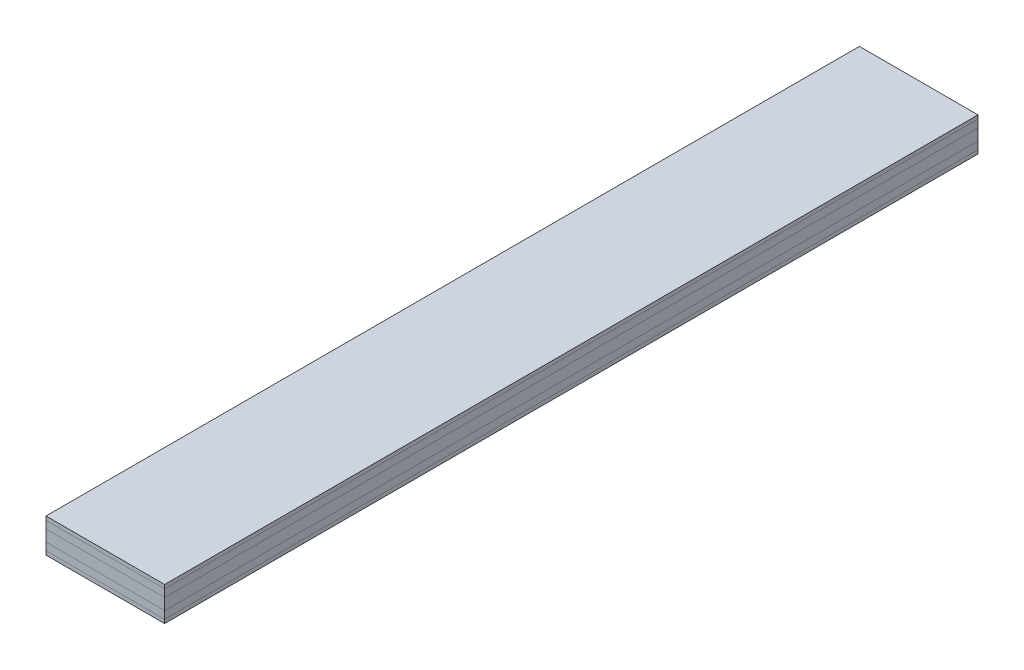
ISO-10303-21;
HEADER;
FILE_DESCRIPTION(('STEP AP214'),'2;1');
FILE_NAME('part.step','',(''),(''),'','','');
FILE_SCHEMA(('AUTOMOTIVE_DESIGN { 1 0 10303 214 1 1 1 1 }'));
ENDSEC;
DATA;
#1=APPLICATION_CONTEXT('core data for automotive mechanical design processes');
#2=APPLICATION_PROTOCOL_DEFINITION('international standard','automotive_design',2000,#1);
#3=PRODUCT_CONTEXT('',#1,'mechanical');
#4=PRODUCT('Part','Part','',(#3));
#5=PRODUCT_RELATED_PRODUCT_CATEGORY('part','',(#4));
#6=PRODUCT_DEFINITION_FORMATION('','',#4);
#7=PRODUCT_DEFINITION_CONTEXT('part definition',#1,'design');
#8=PRODUCT_DEFINITION('design','',#6,#7);
#9=PRODUCT_DEFINITION_SHAPE('','',#8);
#10=(LENGTH_UNIT() NAMED_UNIT(*) SI_UNIT(.MILLI.,.METRE.));
#11=(NAMED_UNIT(*) PLANE_ANGLE_UNIT() SI_UNIT($,.RADIAN.));
#12=(NAMED_UNIT(*) SI_UNIT($,.STERADIAN.) SOLID_ANGLE_UNIT());
#13=UNCERTAINTY_MEASURE_WITH_UNIT(LENGTH_MEASURE(1.E-05),#10,'distance_accuracy_value','');
#14=(GEOMETRIC_REPRESENTATION_CONTEXT(3) GLOBAL_UNCERTAINTY_ASSIGNED_CONTEXT((#13)) GLOBAL_UNIT_ASSIGNED_CONTEXT((#10,
#11,#12)) REPRESENTATION_CONTEXT('',''));
#15=CARTESIAN_POINT('',(0.,0.,0.));
#16=DIRECTION('',(0.,0.,1.));
#17=DIRECTION('',(1.,0.,0.));
#18=AXIS2_PLACEMENT_3D('',#15,#16,#17);
#19=CARTESIAN_POINT('',(-335.28,-2.82222222222222,-609.61));
#20=DIRECTION('',(0.,-1.,0.));
#21=DIRECTION('',(1.,0.,0.));
#22=AXIS2_PLACEMENT_3D('',#19,#20,#21);
#23=PLANE('',#22);
#24=DIRECTION('',(0.,0.,1.));
#25=VECTOR('',#24,1.);
#26=CARTESIAN_POINT('',(215.9,-2.82222222222212,-609.61));
#27=LINE('',#26,#25);
#28=CARTESIAN_POINT('',(215.9,-2.82222222222212,0.));
#29=VERTEX_POINT('',#28);
#30=CARTESIAN_POINT('',(215.9,-2.82222222222212,609.6));
#31=VERTEX_POINT('',#30);
#32=EDGE_CURVE('E64',#29,#31,#27,.T.);
#33=ORIENTED_EDGE('',*,*,#32,.F.);
#34=DIRECTION('',(-1.,0.,0.));
#35=VECTOR('',#34,1.);
#36=CARTESIAN_POINT('',(-335.280000000001,-2.82222222222222,-4.44089209850063E-13));
#37=LINE('',#36,#35);
#38=CARTESIAN_POINT('',(304.8,-2.82222222222217,3.25136742925939E-13));
#39=VERTEX_POINT('',#38);
#40=EDGE_CURVE('E97',#39,#29,#37,.T.);
#41=ORIENTED_EDGE('',*,*,#40,.F.);
#42=DIRECTION('',(0.,0.,-1.));
#43=VECTOR('',#42,1.);
#44=CARTESIAN_POINT('',(304.8,-2.8222222222221,-609.6));
#45=LINE('',#44,#43);
#46=CARTESIAN_POINT('',(304.8,-2.82222222222217,609.6));
#47=VERTEX_POINT('',#46);
#48=EDGE_CURVE('E109',#47,#39,#45,.T.);
#49=ORIENTED_EDGE('',*,*,#48,.F.);
#50=DIRECTION('',(1.,0.,0.));
#51=VECTOR('',#50,1.);
#52=CARTESIAN_POINT('',(-304.8,-2.82222222222222,609.6));
#53=LINE('',#52,#51);
#54=EDGE_CURVE('E113',#31,#47,#53,.T.);
#55=ORIENTED_EDGE('',*,*,#54,.F.);
#56=EDGE_LOOP('',(#33,#41,#49,#55));
#57=FACE_BOUND('',#56,.T.);
#58=ADVANCED_FACE('F49',(#57),#23,.T.);
#59=CARTESIAN_POINT('',(0.,0.,0.));
#60=DIRECTION('',(0.,1.,0.));
#61=DIRECTION('',(0.,0.,1.));
#62=AXIS2_PLACEMENT_3D('',#59,#60,#61);
#63=PLANE('',#62);
#64=DIRECTION('',(0.,0.,-1.));
#65=VECTOR('',#64,1.);
#66=CARTESIAN_POINT('',(215.9,0.,0.));
#67=LINE('',#66,#65);
#68=CARTESIAN_POINT('',(215.9,0.,609.6));
#69=VERTEX_POINT('',#68);
#70=CARTESIAN_POINT('',(215.9,0.,0.));
#71=VERTEX_POINT('',#70);
#72=EDGE_CURVE('E99',#69,#71,#67,.T.);
#73=ORIENTED_EDGE('',*,*,#72,.F.);
#74=DIRECTION('',(1.,0.,0.));
#75=VECTOR('',#74,1.);
#76=CARTESIAN_POINT('',(-304.8,0.,609.6));
#77=LINE('',#76,#75);
#78=CARTESIAN_POINT('',(304.8,0.,609.6));
#79=VERTEX_POINT('',#78);
#80=EDGE_CURVE('E72',#69,#79,#77,.T.);
#81=ORIENTED_EDGE('',*,*,#80,.T.);
#82=DIRECTION('',(0.,0.,-1.));
#83=VECTOR('',#82,1.);
#84=CARTESIAN_POINT('',(304.8,0.,-609.6));
#85=LINE('',#84,#83);
#86=CARTESIAN_POINT('',(304.8,0.,3.25136742925939E-13));
#87=VERTEX_POINT('',#86);
#88=EDGE_CURVE('E104',#79,#87,#85,.T.);
#89=ORIENTED_EDGE('',*,*,#88,.T.);
#90=DIRECTION('',(1.,0.,0.));
#91=VECTOR('',#90,1.);
#92=CARTESIAN_POINT('',(0.,0.,0.));
#93=LINE('',#92,#91);
#94=EDGE_CURVE('E94',#71,#87,#93,.T.);
#95=ORIENTED_EDGE('',*,*,#94,.F.);
#96=EDGE_LOOP('',(#73,#81,#89,#95));
#97=FACE_BOUND('',#96,.T.);
#98=ADVANCED_FACE('F102',(#97),#63,.T.);
#99=CARTESIAN_POINT('',(304.8,-25.4,-609.6));
#100=DIRECTION('',(1.,0.,0.));
#101=DIRECTION('',(0.,0.,-1.));
#102=AXIS2_PLACEMENT_3D('',#99,#100,#101);
#103=PLANE('',#102);
#104=DIRECTION('',(0.,-1.,0.));
#105=VECTOR('',#104,1.);
#106=CARTESIAN_POINT('',(304.8,-25.4,2.22044604925031E-13));
#107=LINE('',#106,#105);
#108=EDGE_CURVE('E12',#87,#39,#107,.T.);
#109=ORIENTED_EDGE('',*,*,#108,.F.);
#110=ORIENTED_EDGE('',*,*,#88,.F.);
#111=DIRECTION('',(0.,1.,0.));
#112=VECTOR('',#111,1.);
#113=CARTESIAN_POINT('',(304.8,-25.4,609.6));
#114=LINE('',#113,#112);
#115=EDGE_CURVE('E111',#47,#79,#114,.T.);
#116=ORIENTED_EDGE('',*,*,#115,.F.);
#117=ORIENTED_EDGE('',*,*,#48,.T.);
#118=EDGE_LOOP('',(#109,#110,#116,#117));
#119=FACE_BOUND('',#118,.T.);
#120=ADVANCED_FACE('F122',(#119),#103,.T.);
#121=CARTESIAN_POINT('',(-304.8,-25.4,609.6));
#122=DIRECTION('',(0.,0.,1.));
#123=DIRECTION('',(1.,0.,0.));
#124=AXIS2_PLACEMENT_3D('',#121,#122,#123);
#125=PLANE('',#124);
#126=DIRECTION('',(0.,1.,0.));
#127=VECTOR('',#126,1.);
#128=CARTESIAN_POINT('',(215.9,-25.4,609.6));
#129=LINE('',#128,#127);
#130=EDGE_CURVE('E57',#31,#69,#129,.T.);
#131=ORIENTED_EDGE('',*,*,#130,.F.);
#132=ORIENTED_EDGE('',*,*,#54,.T.);
#133=ORIENTED_EDGE('',*,*,#115,.T.);
#134=ORIENTED_EDGE('',*,*,#80,.F.);
#135=EDGE_LOOP('',(#131,#132,#133,#134));
#136=FACE_BOUND('',#135,.T.);
#137=ADVANCED_FACE('F51',(#136),#125,.T.);
#138=CARTESIAN_POINT('',(215.9,-25.4,0.));
#139=DIRECTION('',(1.,0.,0.));
#140=DIRECTION('',(0.,0.,-1.));
#141=AXIS2_PLACEMENT_3D('',#138,#139,#140);
#142=PLANE('',#141);
#143=ORIENTED_EDGE('',*,*,#32,.T.);
#144=ORIENTED_EDGE('',*,*,#130,.T.);
#145=ORIENTED_EDGE('',*,*,#72,.T.);
#146=DIRECTION('',(0.,1.,0.));
#147=VECTOR('',#146,1.);
#148=CARTESIAN_POINT('',(215.9,-25.4,0.));
#149=LINE('',#148,#147);
#150=EDGE_CURVE('E90',#29,#71,#149,.T.);
#151=ORIENTED_EDGE('',*,*,#150,.F.);
#152=EDGE_LOOP('',(#143,#144,#145,#151));
#153=FACE_BOUND('',#152,.T.);
#154=ADVANCED_FACE('F100',(#153),#142,.F.);
#155=CARTESIAN_POINT('',(0.,-25.4,0.));
#156=DIRECTION('',(0.,0.,1.));
#157=DIRECTION('',(1.,0.,0.));
#158=AXIS2_PLACEMENT_3D('',#155,#156,#157);
#159=PLANE('',#158);
#160=ORIENTED_EDGE('',*,*,#40,.T.);
#161=ORIENTED_EDGE('',*,*,#150,.T.);
#162=ORIENTED_EDGE('',*,*,#94,.T.);
#163=ORIENTED_EDGE('',*,*,#108,.T.);
#164=EDGE_LOOP('',(#160,#161,#162,#163));
#165=FACE_BOUND('',#164,.T.);
#166=ADVANCED_FACE('F92',(#165),#159,.F.);
#167=CLOSED_SHELL('',(#58,#98,#120,#137,#154,#166));
#168=MANIFOLD_SOLID_BREP('B2',#167);
#169=CARTESIAN_POINT('',(-335.28,-22.5777777777778,-609.61));
#170=DIRECTION('',(0.,-1.,0.));
#171=DIRECTION('',(1.,0.,0.));
#172=AXIS2_PLACEMENT_3D('',#169,#170,#171);
#173=PLANE('',#172);
#174=DIRECTION('',(-1.,0.,0.));
#175=VECTOR('',#174,1.);
#176=CARTESIAN_POINT('',(-335.280000000001,-22.5777777777778,-4.44089209850063E-13));
#177=LINE('',#176,#175);
#178=CARTESIAN_POINT('',(304.8,-22.5777777777777,3.25136742925939E-13));
#179=VERTEX_POINT('',#178);
#180=CARTESIAN_POINT('',(215.9,-22.5777777777777,0.));
#181=VERTEX_POINT('',#180);
#182=EDGE_CURVE('E244',#179,#181,#177,.T.);
#183=ORIENTED_EDGE('',*,*,#182,.T.);
#184=DIRECTION('',(0.,0.,1.));
#185=VECTOR('',#184,1.);
#186=CARTESIAN_POINT('',(215.9,-22.5777777777777,-609.61));
#187=LINE('',#186,#185);
#188=CARTESIAN_POINT('',(215.9,-22.5777777777777,609.6));
#189=VERTEX_POINT('',#188);
#190=EDGE_CURVE('E230',#181,#189,#187,.T.);
#191=ORIENTED_EDGE('',*,*,#190,.T.);
#192=DIRECTION('',(1.,0.,0.));
#193=VECTOR('',#192,1.);
#194=CARTESIAN_POINT('',(-304.8,-22.5777777777778,609.6));
#195=LINE('',#194,#193);
#196=CARTESIAN_POINT('',(304.8,-22.5777777777777,609.6));
#197=VERTEX_POINT('',#196);
#198=EDGE_CURVE('E248',#189,#197,#195,.T.);
#199=ORIENTED_EDGE('',*,*,#198,.T.);
#200=DIRECTION('',(0.,0.,-1.));
#201=VECTOR('',#200,1.);
#202=CARTESIAN_POINT('',(304.8,-22.5777777777777,-609.6));
#203=LINE('',#202,#201);
#204=EDGE_CURVE('E186',#197,#179,#203,.T.);
#205=ORIENTED_EDGE('',*,*,#204,.T.);
#206=EDGE_LOOP('',(#183,#191,#199,#205));
#207=FACE_BOUND('',#206,.T.);
#208=ADVANCED_FACE('F182',(#207),#173,.F.);
#209=CARTESIAN_POINT('',(304.8,-25.4,-609.6));
#210=DIRECTION('',(1.,0.,0.));
#211=DIRECTION('',(0.,0.,-1.));
#212=AXIS2_PLACEMENT_3D('',#209,#210,#211);
#213=PLANE('',#212);
#214=DIRECTION('',(0.,1.,0.));
#215=VECTOR('',#214,1.);
#216=CARTESIAN_POINT('',(304.8,-25.4,3.25136742925939E-13));
#217=LINE('',#216,#215);
#218=CARTESIAN_POINT('',(304.8,-25.4,3.33066907387547E-13));
#219=VERTEX_POINT('',#218);
#220=EDGE_CURVE('E199',#219,#179,#217,.T.);
#221=ORIENTED_EDGE('',*,*,#220,.T.);
#222=ORIENTED_EDGE('',*,*,#204,.F.);
#223=DIRECTION('',(0.,1.,0.));
#224=VECTOR('',#223,1.);
#225=CARTESIAN_POINT('',(304.8,-25.4,609.6));
#226=LINE('',#225,#224);
#227=CARTESIAN_POINT('',(304.8,-25.4,609.6));
#228=VERTEX_POINT('',#227);
#229=EDGE_CURVE('E249',#228,#197,#226,.T.);
#230=ORIENTED_EDGE('',*,*,#229,.F.);
#231=DIRECTION('',(0.,0.,-1.));
#232=VECTOR('',#231,1.);
#233=CARTESIAN_POINT('',(304.8,-25.4,-609.6));
#234=LINE('',#233,#232);
#235=EDGE_CURVE('E191',#228,#219,#234,.T.);
#236=ORIENTED_EDGE('',*,*,#235,.T.);
#237=EDGE_LOOP('',(#221,#222,#230,#236));
#238=FACE_BOUND('',#237,.T.);
#239=ADVANCED_FACE('F256',(#238),#213,.T.);
#240=CARTESIAN_POINT('',(-304.8,-25.4,609.6));
#241=DIRECTION('',(0.,0.,1.));
#242=DIRECTION('',(1.,0.,0.));
#243=AXIS2_PLACEMENT_3D('',#240,#241,#242);
#244=PLANE('',#243);
#245=DIRECTION('',(0.,1.,0.));
#246=VECTOR('',#245,1.);
#247=CARTESIAN_POINT('',(215.9,-25.4,609.6));
#248=LINE('',#247,#246);
#249=CARTESIAN_POINT('',(215.9,-25.4,609.6));
#250=VERTEX_POINT('',#249);
#251=EDGE_CURVE('E242',#250,#189,#248,.T.);
#252=ORIENTED_EDGE('',*,*,#251,.F.);
#253=DIRECTION('',(1.,0.,0.));
#254=VECTOR('',#253,1.);
#255=CARTESIAN_POINT('',(-304.8,-25.4,609.6));
#256=LINE('',#255,#254);
#257=EDGE_CURVE('E47',#250,#228,#256,.T.);
#258=ORIENTED_EDGE('',*,*,#257,.T.);
#259=ORIENTED_EDGE('',*,*,#229,.T.);
#260=ORIENTED_EDGE('',*,*,#198,.F.);
#261=EDGE_LOOP('',(#252,#258,#259,#260));
#262=FACE_BOUND('',#261,.T.);
#263=ADVANCED_FACE('F184',(#262),#244,.T.);
#264=CARTESIAN_POINT('',(0.,-25.4,0.));
#265=DIRECTION('',(0.,1.,0.));
#266=DIRECTION('',(0.,0.,1.));
#267=AXIS2_PLACEMENT_3D('',#264,#265,#266);
#268=PLANE('',#267);
#269=ORIENTED_EDGE('',*,*,#257,.F.);
#270=DIRECTION('',(0.,0.,-1.));
#271=VECTOR('',#270,1.);
#272=CARTESIAN_POINT('',(215.9,-25.4,0.));
#273=LINE('',#272,#271);
#274=CARTESIAN_POINT('',(215.9,-25.4,0.));
#275=VERTEX_POINT('',#274);
#276=EDGE_CURVE('E228',#250,#275,#273,.T.);
#277=ORIENTED_EDGE('',*,*,#276,.T.);
#278=DIRECTION('',(1.,0.,0.));
#279=VECTOR('',#278,1.);
#280=CARTESIAN_POINT('',(0.,-25.4,0.));
#281=LINE('',#280,#279);
#282=EDGE_CURVE('E232',#275,#219,#281,.T.);
#283=ORIENTED_EDGE('',*,*,#282,.T.);
#284=ORIENTED_EDGE('',*,*,#235,.F.);
#285=EDGE_LOOP('',(#269,#277,#283,#284));
#286=FACE_BOUND('',#285,.T.);
#287=ADVANCED_FACE('F239',(#286),#268,.F.);
#288=CARTESIAN_POINT('',(215.9,-25.4,0.));
#289=DIRECTION('',(1.,0.,0.));
#290=DIRECTION('',(0.,0.,-1.));
#291=AXIS2_PLACEMENT_3D('',#288,#289,#290);
#292=PLANE('',#291);
#293=DIRECTION('',(0.,1.,0.));
#294=VECTOR('',#293,1.);
#295=CARTESIAN_POINT('',(215.9,-25.4,0.));
#296=LINE('',#295,#294);
#297=EDGE_CURVE('E225',#275,#181,#296,.T.);
#298=ORIENTED_EDGE('',*,*,#297,.F.);
#299=ORIENTED_EDGE('',*,*,#276,.F.);
#300=ORIENTED_EDGE('',*,*,#251,.T.);
#301=ORIENTED_EDGE('',*,*,#190,.F.);
#302=EDGE_LOOP('',(#298,#299,#300,#301));
#303=FACE_BOUND('',#302,.T.);
#304=ADVANCED_FACE('F226',(#303),#292,.F.);
#305=CARTESIAN_POINT('',(0.,-25.4,0.));
#306=DIRECTION('',(0.,0.,1.));
#307=DIRECTION('',(1.,0.,0.));
#308=AXIS2_PLACEMENT_3D('',#305,#306,#307);
#309=PLANE('',#308);
#310=ORIENTED_EDGE('',*,*,#220,.F.);
#311=ORIENTED_EDGE('',*,*,#282,.F.);
#312=ORIENTED_EDGE('',*,*,#297,.T.);
#313=ORIENTED_EDGE('',*,*,#182,.F.);
#314=EDGE_LOOP('',(#310,#311,#312,#313));
#315=FACE_BOUND('',#314,.T.);
#316=ADVANCED_FACE('F234',(#315),#309,.F.);
#317=CLOSED_SHELL('',(#208,#239,#263,#287,#304,#316));
#318=MANIFOLD_SOLID_BREP('B6',#317);
#319=CARTESIAN_POINT('',(-335.28,-16.9333333333333,-609.61));
#320=DIRECTION('',(0.,-1.,0.));
#321=DIRECTION('',(1.,0.,0.));
#322=AXIS2_PLACEMENT_3D('',#319,#320,#321);
#323=PLANE('',#322);
#324=DIRECTION('',(-1.,0.,0.));
#325=VECTOR('',#324,1.);
#326=CARTESIAN_POINT('',(-335.280000000001,-16.9333333333333,-4.44089209850063E-13));
#327=LINE('',#326,#325);
#328=CARTESIAN_POINT('',(304.8,-16.9333333333332,3.25136742925939E-13));
#329=VERTEX_POINT('',#328);
#330=CARTESIAN_POINT('',(215.9,-16.9333333333332,0.));
#331=VERTEX_POINT('',#330);
#332=EDGE_CURVE('E365',#329,#331,#327,.T.);
#333=ORIENTED_EDGE('',*,*,#332,.T.);
#334=DIRECTION('',(0.,0.,1.));
#335=VECTOR('',#334,1.);
#336=CARTESIAN_POINT('',(215.9,-16.9333333333332,-609.61));
#337=LINE('',#336,#335);
#338=CARTESIAN_POINT('',(215.9,-16.9333333333333,609.6));
#339=VERTEX_POINT('',#338);
#340=EDGE_CURVE('E356',#331,#339,#337,.T.);
#341=ORIENTED_EDGE('',*,*,#340,.T.);
#342=DIRECTION('',(1.,0.,0.));
#343=VECTOR('',#342,1.);
#344=CARTESIAN_POINT('',(-304.8,-16.9333333333333,609.6));
#345=LINE('',#344,#343);
#346=CARTESIAN_POINT('',(304.8,-16.9333333333333,609.6));
#347=VERTEX_POINT('',#346);
#348=EDGE_CURVE('E363',#339,#347,#345,.T.);
#349=ORIENTED_EDGE('',*,*,#348,.T.);
#350=DIRECTION('',(0.,0.,-1.));
#351=VECTOR('',#350,1.);
#352=CARTESIAN_POINT('',(304.8,-16.9333333333332,-609.6));
#353=LINE('',#352,#351);
#354=EDGE_CURVE('E369',#347,#329,#353,.T.);
#355=ORIENTED_EDGE('',*,*,#354,.T.);
#356=EDGE_LOOP('',(#333,#341,#349,#355));
#357=FACE_BOUND('',#356,.T.);
#358=ADVANCED_FACE('F315',(#357),#323,.F.);
#359=CARTESIAN_POINT('',(-335.28,-22.5777777777778,-609.61));
#360=DIRECTION('',(0.,-1.,0.));
#361=DIRECTION('',(1.,0.,0.));
#362=AXIS2_PLACEMENT_3D('',#359,#360,#361);
#363=PLANE('',#362);
#364=DIRECTION('',(0.,0.,1.));
#365=VECTOR('',#364,1.);
#366=CARTESIAN_POINT('',(215.9,-22.5777777777777,-609.61));
#367=LINE('',#366,#365);
#368=CARTESIAN_POINT('',(215.9,-22.5777777777777,0.));
#369=VERTEX_POINT('',#368);
#370=CARTESIAN_POINT('',(215.9,-22.5777777777777,609.6));
#371=VERTEX_POINT('',#370);
#372=EDGE_CURVE('E330',#369,#371,#367,.T.);
#373=ORIENTED_EDGE('',*,*,#372,.F.);
#374=DIRECTION('',(-1.,0.,0.));
#375=VECTOR('',#374,1.);
#376=CARTESIAN_POINT('',(-335.280000000001,-22.5777777777778,-4.44089209850063E-13));
#377=LINE('',#376,#375);
#378=CARTESIAN_POINT('',(304.8,-22.5777777777777,3.25136742925939E-13));
#379=VERTEX_POINT('',#378);
#380=EDGE_CURVE('E366',#379,#369,#377,.T.);
#381=ORIENTED_EDGE('',*,*,#380,.F.);
#382=DIRECTION('',(0.,0.,-1.));
#383=VECTOR('',#382,1.);
#384=CARTESIAN_POINT('',(304.8,-22.5777777777777,-609.6));
#385=LINE('',#384,#383);
#386=CARTESIAN_POINT('',(304.8,-22.5777777777777,609.6));
#387=VERTEX_POINT('',#386);
#388=EDGE_CURVE('E371',#387,#379,#385,.T.);
#389=ORIENTED_EDGE('',*,*,#388,.F.);
#390=DIRECTION('',(1.,0.,0.));
#391=VECTOR('',#390,1.);
#392=CARTESIAN_POINT('',(-304.8,-22.5777777777778,609.6));
#393=LINE('',#392,#391);
#394=EDGE_CURVE('E337',#371,#387,#393,.T.);
#395=ORIENTED_EDGE('',*,*,#394,.F.);
#396=EDGE_LOOP('',(#373,#381,#389,#395));
#397=FACE_BOUND('',#396,.T.);
#398=ADVANCED_FACE('F388',(#397),#363,.T.);
#399=CARTESIAN_POINT('',(304.8,-25.4,-609.6));
#400=DIRECTION('',(1.,0.,0.));
#401=DIRECTION('',(0.,0.,-1.));
#402=AXIS2_PLACEMENT_3D('',#399,#400,#401);
#403=PLANE('',#402);
#404=DIRECTION('',(0.,-1.,0.));
#405=VECTOR('',#404,1.);
#406=CARTESIAN_POINT('',(304.8,-25.4,2.22044604925031E-13));
#407=LINE('',#406,#405);
#408=EDGE_CURVE('E180',#329,#379,#407,.T.);
#409=ORIENTED_EDGE('',*,*,#408,.F.);
#410=ORIENTED_EDGE('',*,*,#354,.F.);
#411=DIRECTION('',(0.,1.,0.));
#412=VECTOR('',#411,1.);
#413=CARTESIAN_POINT('',(304.8,-25.4,609.6));
#414=LINE('',#413,#412);
#415=EDGE_CURVE('E359',#387,#347,#414,.T.);
#416=ORIENTED_EDGE('',*,*,#415,.F.);
#417=ORIENTED_EDGE('',*,*,#388,.T.);
#418=EDGE_LOOP('',(#409,#410,#416,#417));
#419=FACE_BOUND('',#418,.T.);
#420=ADVANCED_FACE('F389',(#419),#403,.T.);
#421=CARTESIAN_POINT('',(-304.8,-25.4,609.6));
#422=DIRECTION('',(0.,0.,1.));
#423=DIRECTION('',(1.,0.,0.));
#424=AXIS2_PLACEMENT_3D('',#421,#422,#423);
#425=PLANE('',#424);
#426=DIRECTION('',(0.,1.,0.));
#427=VECTOR('',#426,1.);
#428=CARTESIAN_POINT('',(215.9,-25.4,609.6));
#429=LINE('',#428,#427);
#430=EDGE_CURVE('E323',#371,#339,#429,.T.);
#431=ORIENTED_EDGE('',*,*,#430,.F.);
#432=ORIENTED_EDGE('',*,*,#394,.T.);
#433=ORIENTED_EDGE('',*,*,#415,.T.);
#434=ORIENTED_EDGE('',*,*,#348,.F.);
#435=EDGE_LOOP('',(#431,#432,#433,#434));
#436=FACE_BOUND('',#435,.T.);
#437=ADVANCED_FACE('F317',(#436),#425,.T.);
#438=CARTESIAN_POINT('',(0.,-25.4,0.));
#439=DIRECTION('',(0.,0.,1.));
#440=DIRECTION('',(1.,0.,0.));
#441=AXIS2_PLACEMENT_3D('',#438,#439,#440);
#442=PLANE('',#441);
#443=ORIENTED_EDGE('',*,*,#408,.T.);
#444=ORIENTED_EDGE('',*,*,#380,.T.);
#445=DIRECTION('',(0.,1.,0.));
#446=VECTOR('',#445,1.);
#447=CARTESIAN_POINT('',(215.9,-25.4,0.));
#448=LINE('',#447,#446);
#449=EDGE_CURVE('E383',#369,#331,#448,.T.);
#450=ORIENTED_EDGE('',*,*,#449,.T.);
#451=ORIENTED_EDGE('',*,*,#332,.F.);
#452=EDGE_LOOP('',(#443,#444,#450,#451));
#453=FACE_BOUND('',#452,.T.);
#454=ADVANCED_FACE('F385',(#453),#442,.F.);
#455=CARTESIAN_POINT('',(215.9,-25.4,0.));
#456=DIRECTION('',(1.,0.,0.));
#457=DIRECTION('',(0.,0.,-1.));
#458=AXIS2_PLACEMENT_3D('',#455,#456,#457);
#459=PLANE('',#458);
#460=ORIENTED_EDGE('',*,*,#449,.F.);
#461=ORIENTED_EDGE('',*,*,#372,.T.);
#462=ORIENTED_EDGE('',*,*,#430,.T.);
#463=ORIENTED_EDGE('',*,*,#340,.F.);
#464=EDGE_LOOP('',(#460,#461,#462,#463));
#465=FACE_BOUND('',#464,.T.);
#466=ADVANCED_FACE('F355',(#465),#459,.F.);
#467=CLOSED_SHELL('',(#358,#398,#420,#437,#454,#466));
#468=MANIFOLD_SOLID_BREP('B41',#467);
#469=CARTESIAN_POINT('',(-335.28,-8.46666666666667,-609.61));
#470=DIRECTION('',(0.,-1.,0.));
#471=DIRECTION('',(1.,0.,0.));
#472=AXIS2_PLACEMENT_3D('',#469,#470,#471);
#473=PLANE('',#472);
#474=DIRECTION('',(-1.,0.,0.));
#475=VECTOR('',#474,1.);
#476=CARTESIAN_POINT('',(-335.280000000001,-8.46666666666667,-4.44089209850063E-13));
#477=LINE('',#476,#475);
#478=CARTESIAN_POINT('',(304.8,-8.46666666666656,3.25136742925939E-13));
#479=VERTEX_POINT('',#478);
#480=CARTESIAN_POINT('',(215.9,-8.46666666666656,0.));
#481=VERTEX_POINT('',#480);
#482=EDGE_CURVE('E499',#479,#481,#477,.T.);
#483=ORIENTED_EDGE('',*,*,#482,.T.);
#484=DIRECTION('',(0.,0.,1.));
#485=VECTOR('',#484,1.);
#486=CARTESIAN_POINT('',(215.9,-8.46666666666657,-609.61));
#487=LINE('',#486,#485);
#488=CARTESIAN_POINT('',(215.9,-8.46666666666662,609.6));
#489=VERTEX_POINT('',#488);
#490=EDGE_CURVE('E489',#481,#489,#487,.T.);
#491=ORIENTED_EDGE('',*,*,#490,.T.);
#492=DIRECTION('',(1.,0.,0.));
#493=VECTOR('',#492,1.);
#494=CARTESIAN_POINT('',(-304.8,-8.46666666666666,609.6));
#495=LINE('',#494,#493);
#496=CARTESIAN_POINT('',(304.8,-8.46666666666661,609.6));
#497=VERTEX_POINT('',#496);
#498=EDGE_CURVE('E497',#489,#497,#495,.T.);
#499=ORIENTED_EDGE('',*,*,#498,.T.);
#500=DIRECTION('',(0.,0.,-1.));
#501=VECTOR('',#500,1.);
#502=CARTESIAN_POINT('',(304.8,-8.46666666666655,-609.6));
#503=LINE('',#502,#501);
#504=EDGE_CURVE('E505',#497,#479,#503,.T.);
#505=ORIENTED_EDGE('',*,*,#504,.T.);
#506=EDGE_LOOP('',(#483,#491,#499,#505));
#507=FACE_BOUND('',#506,.T.);
#508=ADVANCED_FACE('F447',(#507),#473,.F.);
#509=CARTESIAN_POINT('',(-335.28,-16.9333333333333,-609.61));
#510=DIRECTION('',(0.,-1.,0.));
#511=DIRECTION('',(1.,0.,0.));
#512=AXIS2_PLACEMENT_3D('',#509,#510,#511);
#513=PLANE('',#512);
#514=DIRECTION('',(0.,0.,1.));
#515=VECTOR('',#514,1.);
#516=CARTESIAN_POINT('',(215.9,-16.9333333333332,-609.61));
#517=LINE('',#516,#515);
#518=CARTESIAN_POINT('',(215.9,-16.9333333333332,0.));
#519=VERTEX_POINT('',#518);
#520=CARTESIAN_POINT('',(215.9,-16.9333333333332,609.6));
#521=VERTEX_POINT('',#520);
#522=EDGE_CURVE('E463',#519,#521,#517,.T.);
#523=ORIENTED_EDGE('',*,*,#522,.F.);
#524=DIRECTION('',(-1.,0.,0.));
#525=VECTOR('',#524,1.);
#526=CARTESIAN_POINT('',(-335.280000000001,-16.9333333333333,-4.44089209850063E-13));
#527=LINE('',#526,#525);
#528=CARTESIAN_POINT('',(304.8,-16.9333333333333,3.25136742925939E-13));
#529=VERTEX_POINT('',#528);
#530=EDGE_CURVE('E501',#529,#519,#527,.T.);
#531=ORIENTED_EDGE('',*,*,#530,.F.);
#532=DIRECTION('',(0.,0.,-1.));
#533=VECTOR('',#532,1.);
#534=CARTESIAN_POINT('',(304.8,-16.9333333333332,-609.6));
#535=LINE('',#534,#533);
#536=CARTESIAN_POINT('',(304.8,-16.9333333333333,609.6));
#537=VERTEX_POINT('',#536);
#538=EDGE_CURVE('E509',#537,#529,#535,.T.);
#539=ORIENTED_EDGE('',*,*,#538,.F.);
#540=DIRECTION('',(1.,0.,0.));
#541=VECTOR('',#540,1.);
#542=CARTESIAN_POINT('',(-304.8,-16.9333333333333,609.6));
#543=LINE('',#542,#541);
#544=EDGE_CURVE('E470',#521,#537,#543,.T.);
#545=ORIENTED_EDGE('',*,*,#544,.F.);
#546=EDGE_LOOP('',(#523,#531,#539,#545));
#547=FACE_BOUND('',#546,.T.);
#548=ADVANCED_FACE('F531',(#547),#513,.T.);
#549=CARTESIAN_POINT('',(304.8,-25.4,-609.6));
#550=DIRECTION('',(1.,0.,0.));
#551=DIRECTION('',(0.,0.,-1.));
#552=AXIS2_PLACEMENT_3D('',#549,#550,#551);
#553=PLANE('',#552);
#554=DIRECTION('',(0.,-1.,0.));
#555=VECTOR('',#554,1.);
#556=CARTESIAN_POINT('',(304.8,-25.4,2.22044604925031E-13));
#557=LINE('',#556,#555);
#558=EDGE_CURVE('E313',#479,#529,#557,.T.);
#559=ORIENTED_EDGE('',*,*,#558,.F.);
#560=ORIENTED_EDGE('',*,*,#504,.F.);
#561=DIRECTION('',(0.,1.,0.));
#562=VECTOR('',#561,1.);
#563=CARTESIAN_POINT('',(304.8,-25.4,609.6));
#564=LINE('',#563,#562);
#565=EDGE_CURVE('E493',#537,#497,#564,.T.);
#566=ORIENTED_EDGE('',*,*,#565,.F.);
#567=ORIENTED_EDGE('',*,*,#538,.T.);
#568=EDGE_LOOP('',(#559,#560,#566,#567));
#569=FACE_BOUND('',#568,.T.);
#570=ADVANCED_FACE('F533',(#569),#553,.T.);
#571=CARTESIAN_POINT('',(-304.8,-25.4,609.6));
#572=DIRECTION('',(0.,0.,1.));
#573=DIRECTION('',(1.,0.,0.));
#574=AXIS2_PLACEMENT_3D('',#571,#572,#573);
#575=PLANE('',#574);
#576=DIRECTION('',(0.,1.,0.));
#577=VECTOR('',#576,1.);
#578=CARTESIAN_POINT('',(215.9,-25.4,609.6));
#579=LINE('',#578,#577);
#580=EDGE_CURVE('E456',#521,#489,#579,.T.);
#581=ORIENTED_EDGE('',*,*,#580,.F.);
#582=ORIENTED_EDGE('',*,*,#544,.T.);
#583=ORIENTED_EDGE('',*,*,#565,.T.);
#584=ORIENTED_EDGE('',*,*,#498,.F.);
#585=EDGE_LOOP('',(#581,#582,#583,#584));
#586=FACE_BOUND('',#585,.T.);
#587=ADVANCED_FACE('F449',(#586),#575,.T.);
#588=CARTESIAN_POINT('',(0.,-25.4,0.));
#589=DIRECTION('',(0.,0.,1.));
#590=DIRECTION('',(1.,0.,0.));
#591=AXIS2_PLACEMENT_3D('',#588,#589,#590);
#592=PLANE('',#591);
#593=ORIENTED_EDGE('',*,*,#558,.T.);
#594=ORIENTED_EDGE('',*,*,#530,.T.);
#595=DIRECTION('',(0.,1.,0.));
#596=VECTOR('',#595,1.);
#597=CARTESIAN_POINT('',(215.9,-25.4,0.));
#598=LINE('',#597,#596);
#599=EDGE_CURVE('E524',#519,#481,#598,.T.);
#600=ORIENTED_EDGE('',*,*,#599,.T.);
#601=ORIENTED_EDGE('',*,*,#482,.F.);
#602=EDGE_LOOP('',(#593,#594,#600,#601));
#603=FACE_BOUND('',#602,.T.);
#604=ADVANCED_FACE('F527',(#603),#592,.F.);
#605=CARTESIAN_POINT('',(215.9,-25.4,0.));
#606=DIRECTION('',(1.,0.,0.));
#607=DIRECTION('',(0.,0.,-1.));
#608=AXIS2_PLACEMENT_3D('',#605,#606,#607);
#609=PLANE('',#608);
#610=ORIENTED_EDGE('',*,*,#599,.F.);
#611=ORIENTED_EDGE('',*,*,#522,.T.);
#612=ORIENTED_EDGE('',*,*,#580,.T.);
#613=ORIENTED_EDGE('',*,*,#490,.F.);
#614=EDGE_LOOP('',(#610,#611,#612,#613));
#615=FACE_BOUND('',#614,.T.);
#616=ADVANCED_FACE('F488',(#615),#609,.F.);
#617=CLOSED_SHELL('',(#508,#548,#570,#587,#604,#616));
#618=MANIFOLD_SOLID_BREP('B174',#617);
#619=CARTESIAN_POINT('',(-335.28,-2.82222222222222,-609.61));
#620=DIRECTION('',(0.,-1.,0.));
#621=DIRECTION('',(1.,0.,0.));
#622=AXIS2_PLACEMENT_3D('',#619,#620,#621);
#623=PLANE('',#622);
#624=DIRECTION('',(-1.,0.,0.));
#625=VECTOR('',#624,1.);
#626=CARTESIAN_POINT('',(-335.280000000001,-2.82222222222222,-4.44089209850063E-13));
#627=LINE('',#626,#625);
#628=CARTESIAN_POINT('',(304.8,-2.82222222222212,3.25136742925939E-13));
#629=VERTEX_POINT('',#628);
#630=CARTESIAN_POINT('',(215.9,-2.82222222222212,0.));
#631=VERTEX_POINT('',#630);
#632=EDGE_CURVE('E627',#629,#631,#627,.T.);
#633=ORIENTED_EDGE('',*,*,#632,.T.);
#634=DIRECTION('',(0.,0.,1.));
#635=VECTOR('',#634,1.);
#636=CARTESIAN_POINT('',(215.9,-2.82222222222212,-609.61));
#637=LINE('',#636,#635);
#638=CARTESIAN_POINT('',(215.9,-2.82222222222217,609.6));
#639=VERTEX_POINT('',#638);
#640=EDGE_CURVE('E622',#631,#639,#637,.T.);
#641=ORIENTED_EDGE('',*,*,#640,.T.);
#642=DIRECTION('',(1.,0.,0.));
#643=VECTOR('',#642,1.);
#644=CARTESIAN_POINT('',(-304.8,-2.82222222222222,609.6));
#645=LINE('',#644,#643);
#646=CARTESIAN_POINT('',(304.8,-2.82222222222217,609.6));
#647=VERTEX_POINT('',#646);
#648=EDGE_CURVE('E604',#639,#647,#645,.T.);
#649=ORIENTED_EDGE('',*,*,#648,.T.);
#650=DIRECTION('',(0.,0.,-1.));
#651=VECTOR('',#650,1.);
#652=CARTESIAN_POINT('',(304.8,-2.8222222222221,-609.6));
#653=LINE('',#652,#651);
#654=EDGE_CURVE('E634',#647,#629,#653,.T.);
#655=ORIENTED_EDGE('',*,*,#654,.T.);
#656=EDGE_LOOP('',(#633,#641,#649,#655));
#657=FACE_BOUND('',#656,.T.);
#658=ADVANCED_FACE('F582',(#657),#623,.F.);
#659=CARTESIAN_POINT('',(-335.28,-8.46666666666667,-609.61));
#660=DIRECTION('',(0.,-1.,0.));
#661=DIRECTION('',(1.,0.,0.));
#662=AXIS2_PLACEMENT_3D('',#659,#660,#661);
#663=PLANE('',#662);
#664=DIRECTION('',(0.,0.,1.));
#665=VECTOR('',#664,1.);
#666=CARTESIAN_POINT('',(215.9,-8.46666666666657,-609.61));
#667=LINE('',#666,#665);
#668=CARTESIAN_POINT('',(215.9,-8.46666666666656,0.));
#669=VERTEX_POINT('',#668);
#670=CARTESIAN_POINT('',(215.9,-8.46666666666657,609.6));
#671=VERTEX_POINT('',#670);
#672=EDGE_CURVE('E596',#669,#671,#667,.T.);
#673=ORIENTED_EDGE('',*,*,#672,.F.);
#674=DIRECTION('',(-1.,0.,0.));
#675=VECTOR('',#674,1.);
#676=CARTESIAN_POINT('',(-335.280000000001,-8.46666666666667,-4.44089209850063E-13));
#677=LINE('',#676,#675);
#678=CARTESIAN_POINT('',(304.8,-8.46666666666662,3.25136742925939E-13));
#679=VERTEX_POINT('',#678);
#680=EDGE_CURVE('E628',#679,#669,#677,.T.);
#681=ORIENTED_EDGE('',*,*,#680,.F.);
#682=DIRECTION('',(0.,0.,-1.));
#683=VECTOR('',#682,1.);
#684=CARTESIAN_POINT('',(304.8,-8.46666666666655,-609.6));
#685=LINE('',#684,#683);
#686=CARTESIAN_POINT('',(304.8,-8.46666666666661,609.6));
#687=VERTEX_POINT('',#686);
#688=EDGE_CURVE('E636',#687,#679,#685,.T.);
#689=ORIENTED_EDGE('',*,*,#688,.F.);
#690=DIRECTION('',(1.,0.,0.));
#691=VECTOR('',#690,1.);
#692=CARTESIAN_POINT('',(-304.8,-8.46666666666666,609.6));
#693=LINE('',#692,#691);
#694=EDGE_CURVE('E641',#671,#687,#693,.T.);
#695=ORIENTED_EDGE('',*,*,#694,.F.);
#696=EDGE_LOOP('',(#673,#681,#689,#695));
#697=FACE_BOUND('',#696,.T.);
#698=ADVANCED_FACE('F650',(#697),#663,.T.);
#699=CARTESIAN_POINT('',(304.8,-25.4,-609.6));
#700=DIRECTION('',(1.,0.,0.));
#701=DIRECTION('',(0.,0.,-1.));
#702=AXIS2_PLACEMENT_3D('',#699,#700,#701);
#703=PLANE('',#702);
#704=DIRECTION('',(0.,-1.,0.));
#705=VECTOR('',#704,1.);
#706=CARTESIAN_POINT('',(304.8,-25.4,2.22044604925031E-13));
#707=LINE('',#706,#705);
#708=EDGE_CURVE('E445',#629,#679,#707,.T.);
#709=ORIENTED_EDGE('',*,*,#708,.F.);
#710=ORIENTED_EDGE('',*,*,#654,.F.);
#711=DIRECTION('',(0.,1.,0.));
#712=VECTOR('',#711,1.);
#713=CARTESIAN_POINT('',(304.8,-25.4,609.6));
#714=LINE('',#713,#712);
#715=EDGE_CURVE('E633',#687,#647,#714,.T.);
#716=ORIENTED_EDGE('',*,*,#715,.F.);
#717=ORIENTED_EDGE('',*,*,#688,.T.);
#718=EDGE_LOOP('',(#709,#710,#716,#717));
#719=FACE_BOUND('',#718,.T.);
#720=ADVANCED_FACE('F647',(#719),#703,.T.);
#721=CARTESIAN_POINT('',(-304.8,-25.4,609.6));
#722=DIRECTION('',(0.,0.,1.));
#723=DIRECTION('',(1.,0.,0.));
#724=AXIS2_PLACEMENT_3D('',#721,#722,#723);
#725=PLANE('',#724);
#726=DIRECTION('',(0.,1.,0.));
#727=VECTOR('',#726,1.);
#728=CARTESIAN_POINT('',(215.9,-25.4,609.6));
#729=LINE('',#728,#727);
#730=EDGE_CURVE('E589',#671,#639,#729,.T.);
#731=ORIENTED_EDGE('',*,*,#730,.F.);
#732=ORIENTED_EDGE('',*,*,#694,.T.);
#733=ORIENTED_EDGE('',*,*,#715,.T.);
#734=ORIENTED_EDGE('',*,*,#648,.F.);
#735=EDGE_LOOP('',(#731,#732,#733,#734));
#736=FACE_BOUND('',#735,.T.);
#737=ADVANCED_FACE('F631',(#736),#725,.T.);
#738=CARTESIAN_POINT('',(0.,-25.4,0.));
#739=DIRECTION('',(0.,0.,1.));
#740=DIRECTION('',(1.,0.,0.));
#741=AXIS2_PLACEMENT_3D('',#738,#739,#740);
#742=PLANE('',#741);
#743=ORIENTED_EDGE('',*,*,#708,.T.);
#744=ORIENTED_EDGE('',*,*,#680,.T.);
#745=DIRECTION('',(0.,1.,0.));
#746=VECTOR('',#745,1.);
#747=CARTESIAN_POINT('',(215.9,-25.4,0.));
#748=LINE('',#747,#746);
#749=EDGE_CURVE('E655',#669,#631,#748,.T.);
#750=ORIENTED_EDGE('',*,*,#749,.T.);
#751=ORIENTED_EDGE('',*,*,#632,.F.);
#752=EDGE_LOOP('',(#743,#744,#750,#751));
#753=FACE_BOUND('',#752,.T.);
#754=ADVANCED_FACE('F656',(#753),#742,.F.);
#755=CARTESIAN_POINT('',(215.9,-25.4,0.));
#756=DIRECTION('',(1.,0.,0.));
#757=DIRECTION('',(0.,0.,-1.));
#758=AXIS2_PLACEMENT_3D('',#755,#756,#757);
#759=PLANE('',#758);
#760=ORIENTED_EDGE('',*,*,#749,.F.);
#761=ORIENTED_EDGE('',*,*,#672,.T.);
#762=ORIENTED_EDGE('',*,*,#730,.T.);
#763=ORIENTED_EDGE('',*,*,#640,.F.);
#764=EDGE_LOOP('',(#760,#761,#762,#763));
#765=FACE_BOUND('',#764,.T.);
#766=ADVANCED_FACE('F621',(#765),#759,.F.);
#767=CLOSED_SHELL('',(#658,#698,#720,#737,#754,#766));
#768=MANIFOLD_SOLID_BREP('B307',#767);
#769=ADVANCED_BREP_SHAPE_REPRESENTATION('',(#18,#168,#318,#468,#618,#768),#14);
#770=SHAPE_DEFINITION_REPRESENTATION(#9,#769);
ENDSEC;
END-ISO-10303-21;
